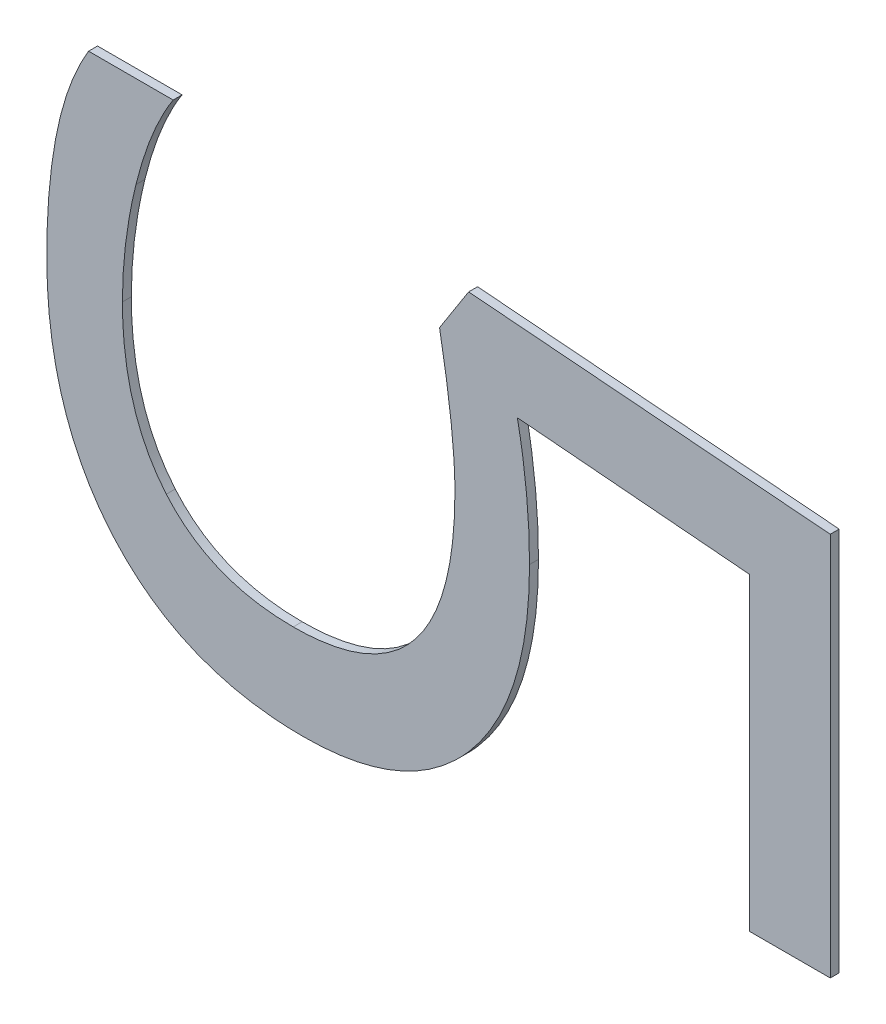
ISO-10303-21;
HEADER;
FILE_DESCRIPTION(('STEP AP214'),'2;1');
FILE_NAME('part.step','',(''),(''),'','','');
FILE_SCHEMA(('AUTOMOTIVE_DESIGN { 1 0 10303 214 1 1 1 1 }'));
ENDSEC;
DATA;
#1=APPLICATION_CONTEXT('core data for automotive mechanical design processes');
#2=APPLICATION_PROTOCOL_DEFINITION('international standard','automotive_design',2000,#1);
#3=PRODUCT_CONTEXT('',#1,'mechanical');
#4=PRODUCT('Part','Part','',(#3));
#5=PRODUCT_RELATED_PRODUCT_CATEGORY('part','',(#4));
#6=PRODUCT_DEFINITION_FORMATION('','',#4);
#7=PRODUCT_DEFINITION_CONTEXT('part definition',#1,'design');
#8=PRODUCT_DEFINITION('design','',#6,#7);
#9=PRODUCT_DEFINITION_SHAPE('','',#8);
#10=(LENGTH_UNIT() NAMED_UNIT(*) SI_UNIT(.MILLI.,.METRE.));
#11=(NAMED_UNIT(*) PLANE_ANGLE_UNIT() SI_UNIT($,.RADIAN.));
#12=(NAMED_UNIT(*) SI_UNIT($,.STERADIAN.) SOLID_ANGLE_UNIT());
#13=UNCERTAINTY_MEASURE_WITH_UNIT(LENGTH_MEASURE(1.E-05),#10,'distance_accuracy_value','');
#14=(GEOMETRIC_REPRESENTATION_CONTEXT(3) GLOBAL_UNCERTAINTY_ASSIGNED_CONTEXT((#13)) GLOBAL_UNIT_ASSIGNED_CONTEXT((#10,
#11,#12)) REPRESENTATION_CONTEXT('',''));
#15=CARTESIAN_POINT('',(0.,0.,0.));
#16=DIRECTION('',(0.,0.,1.));
#17=DIRECTION('',(1.,0.,0.));
#18=AXIS2_PLACEMENT_3D('',#15,#16,#17);
#19=CARTESIAN_POINT('',(32.574920494297,13.734089114766,2.65));
#20=DIRECTION('',(0.,0.,1.));
#21=DIRECTION('',(1.,0.,0.));
#22=AXIS2_PLACEMENT_3D('',#19,#20,#21);
#23=PLANE('',#22);
#24=CARTESIAN_POINT('',(33.67297280187,12.572173262937,2.65));
#25=CARTESIAN_POINT('',(33.749309011932,12.486756165432,2.65));
#26=CARTESIAN_POINT('',(33.883441286861,12.486756165432,2.65));
#27=B_SPLINE_CURVE_WITH_KNOTS('',2,(#24,#25,#26),.UNSPECIFIED.,.F.,.F.,(3,3),(0.,1.),.UNSPECIFIED.);
#28=CARTESIAN_POINT('',(33.67297280187,12.572173262937,2.65));
#29=VERTEX_POINT('',#28);
#30=CARTESIAN_POINT('',(33.883441286861,12.486756165432,2.65));
#31=VERTEX_POINT('',#30);
#32=EDGE_CURVE('E231',#29,#31,#27,.T.);
#33=ORIENTED_EDGE('',*,*,#32,.T.);
#34=CARTESIAN_POINT('',(33.883441286861,12.486756165432,2.65));
#35=CARTESIAN_POINT('',(34.001114453301,12.486756165432,2.65));
#36=CARTESIAN_POINT('',(34.068842738808,12.565078819622,2.65));
#37=B_SPLINE_CURVE_WITH_KNOTS('',2,(#34,#35,#36),.UNSPECIFIED.,.F.,.F.,(3,3),(0.,1.),.UNSPECIFIED.);
#38=CARTESIAN_POINT('',(34.068842738808,12.565078819622,2.65));
#39=VERTEX_POINT('',#38);
#40=EDGE_CURVE('E136',#31,#39,#37,.T.);
#41=ORIENTED_EDGE('',*,*,#40,.T.);
#42=CARTESIAN_POINT('',(34.068842738808,12.565078819622,2.65));
#43=CARTESIAN_POINT('',(34.136571024315,12.643401473812,2.65));
#44=CARTESIAN_POINT('',(34.136571024315,12.779993155757,2.65));
#45=B_SPLINE_CURVE_WITH_KNOTS('',2,(#42,#43,#44),.UNSPECIFIED.,.F.,.F.,(3,3),(0.,1.),.UNSPECIFIED.);
#46=CARTESIAN_POINT('',(34.136571024315,12.779993155757,2.65));
#47=VERTEX_POINT('',#46);
#48=EDGE_CURVE('E135',#39,#47,#45,.T.);
#49=ORIENTED_EDGE('',*,*,#48,.T.);
#50=CARTESIAN_POINT('',(34.136571024315,12.779993155757,2.65));
#51=CARTESIAN_POINT('',(34.136571024315,12.847532256109,2.65));
#52=CARTESIAN_POINT('',(34.122949693152,12.915449726771,2.65));
#53=B_SPLINE_CURVE_WITH_KNOTS('',2,(#50,#51,#52),.UNSPECIFIED.,.F.,.F.,(3,3),(0.,1.),.UNSPECIFIED.);
#54=CARTESIAN_POINT('',(34.122949693152,12.9154497267709,2.65));
#55=VERTEX_POINT('',#54);
#56=EDGE_CURVE('E123',#47,#55,#53,.T.);
#57=ORIENTED_EDGE('',*,*,#56,.T.);
#58=DIRECTION('',(-0.996444857796494,0.0842475244201518,0.));
#59=VECTOR('',#58,1.);
#60=CARTESIAN_POINT('',(34.252730709515,12.904476987778,2.65));
#61=LINE('',#60,#59);
#62=CARTESIAN_POINT('',(34.382511725878,12.8935042487851,2.65));
#63=VERTEX_POINT('',#62);
#64=EDGE_CURVE('E282',#55,#63,#61,.F.);
#65=ORIENTED_EDGE('',*,*,#64,.T.);
#66=DIRECTION('',(0.,1.,0.));
#67=VECTOR('',#66,1.);
#68=CARTESIAN_POINT('',(34.382511725878,12.720589017072,2.65));
#69=LINE('',#68,#67);
#70=CARTESIAN_POINT('',(34.382511725878,12.547673785358,2.65));
#71=VERTEX_POINT('',#70);
#72=EDGE_CURVE('E277',#63,#71,#69,.F.);
#73=ORIENTED_EDGE('',*,*,#72,.T.);
#74=DIRECTION('',(1.,0.,0.));
#75=VECTOR('',#74,1.);
#76=CARTESIAN_POINT('',(34.427726977934,12.547673785358,2.65));
#77=LINE('',#76,#75);
#78=CARTESIAN_POINT('',(34.47294222999,12.547673785358,2.65));
#79=VERTEX_POINT('',#78);
#80=EDGE_CURVE('E271',#71,#79,#77,.T.);
#81=ORIENTED_EDGE('',*,*,#80,.T.);
#82=DIRECTION('',(0.,1.,0.));
#83=VECTOR('',#82,1.);
#84=CARTESIAN_POINT('',(34.47294222999,12.762588121492,2.65));
#85=LINE('',#84,#83);
#86=CARTESIAN_POINT('',(34.47294222999,12.9775024576269,2.65));
#87=VERTEX_POINT('',#86);
#88=EDGE_CURVE('E265',#79,#87,#85,.T.);
#89=ORIENTED_EDGE('',*,*,#88,.T.);
#90=DIRECTION('',(0.996779601288661,-0.0801899398604227,0.));
#91=VECTOR('',#90,1.);
#92=CARTESIAN_POINT('',(34.270703299244,12.993772380961,2.65));
#93=LINE('',#92,#91);
#94=CARTESIAN_POINT('',(34.0684643684981,13.010042304295,2.65));
#95=VERTEX_POINT('',#94);
#96=EDGE_CURVE('E259',#87,#95,#93,.F.);
#97=ORIENTED_EDGE('',*,*,#96,.T.);
#98=DIRECTION('',(0.538698147162689,0.842498846434514,0.));
#99=VECTOR('',#98,1.);
#100=CARTESIAN_POINT('',(34.052194445164,12.984596900941,2.65));
#101=LINE('',#100,#99);
#102=CARTESIAN_POINT('',(34.0359245218299,12.959151497587,2.65));
#103=VERTEX_POINT('',#102);
#104=EDGE_CURVE('E254',#95,#103,#101,.F.);
#105=ORIENTED_EDGE('',*,*,#104,.T.);
#106=CARTESIAN_POINT('',(34.03592452183,12.959151497587,2.65));
#107=CARTESIAN_POINT('',(34.053140370939,12.865126475528,2.65));
#108=CARTESIAN_POINT('',(34.053140370939,12.808938484479,2.65));
#109=B_SPLINE_CURVE_WITH_KNOTS('',2,(#106,#107,#108),.UNSPECIFIED.,.F.,.F.,(3,3),(0.,1.),.UNSPECIFIED.);
#110=CARTESIAN_POINT('',(34.053140370939,12.808938484479,2.65));
#111=VERTEX_POINT('',#110);
#112=EDGE_CURVE('E157',#103,#111,#109,.T.);
#113=ORIENTED_EDGE('',*,*,#112,.T.);
#114=CARTESIAN_POINT('',(34.053140370939,12.808938484479,2.65));
#115=CARTESIAN_POINT('',(34.053140370939,12.587402667918,2.65));
#116=CARTESIAN_POINT('',(33.872279362713,12.587402667918,2.65));
#117=B_SPLINE_CURVE_WITH_KNOTS('',2,(#114,#115,#116),.UNSPECIFIED.,.F.,.F.,(3,3),(0.,1.),.UNSPECIFIED.);
#118=CARTESIAN_POINT('',(33.872279362713,12.587402667918,2.65));
#119=VERTEX_POINT('',#118);
#120=EDGE_CURVE('E167',#111,#119,#117,.T.);
#121=ORIENTED_EDGE('',*,*,#120,.T.);
#122=CARTESIAN_POINT('',(33.872279362713,12.587402667918,2.65));
#123=CARTESIAN_POINT('',(33.779389451585,12.587402667918,2.65));
#124=CARTESIAN_POINT('',(33.73029590385,12.64500954763,2.65));
#125=B_SPLINE_CURVE_WITH_KNOTS('',2,(#122,#123,#124),.UNSPECIFIED.,.F.,.F.,(3,3),(0.,1.),.UNSPECIFIED.);
#126=CARTESIAN_POINT('',(33.73029590385,12.64500954763,2.65));
#127=VERTEX_POINT('',#126);
#128=EDGE_CURVE('E176',#119,#127,#125,.T.);
#129=ORIENTED_EDGE('',*,*,#128,.T.);
#130=CARTESIAN_POINT('',(33.73029590385,12.64500954763,2.65));
#131=CARTESIAN_POINT('',(33.681202356115,12.702616427342,2.65));
#132=CARTESIAN_POINT('',(33.681202356115,12.806668262618,2.65));
#133=B_SPLINE_CURVE_WITH_KNOTS('',2,(#130,#131,#132),.UNSPECIFIED.,.F.,.F.,(3,3),(0.,1.),.UNSPECIFIED.);
#134=CARTESIAN_POINT('',(33.681202356115,12.806668262618,2.65));
#135=VERTEX_POINT('',#134);
#136=EDGE_CURVE('E185',#127,#135,#133,.T.);
#137=ORIENTED_EDGE('',*,*,#136,.T.);
#138=CARTESIAN_POINT('',(33.681202356115,12.806668262618,2.65));
#139=CARTESIAN_POINT('',(33.681202356115,12.866450771614,2.65));
#140=CARTESIAN_POINT('',(33.696337168519,12.927935947004,2.65));
#141=B_SPLINE_CURVE_WITH_KNOTS('',2,(#138,#139,#140),.UNSPECIFIED.,.F.,.F.,(3,3),(0.,1.),.UNSPECIFIED.);
#142=CARTESIAN_POINT('',(33.696337168519,12.927935947004,2.65));
#143=VERTEX_POINT('',#142);
#144=EDGE_CURVE('E194',#135,#143,#141,.T.);
#145=ORIENTED_EDGE('',*,*,#144,.T.);
#146=CARTESIAN_POINT('',(33.696337168519,12.927935947004,2.65));
#147=CARTESIAN_POINT('',(33.711471980923,12.989421122395,2.65));
#148=CARTESIAN_POINT('',(33.737957902629,13.030663486195,2.65));
#149=B_SPLINE_CURVE_WITH_KNOTS('',2,(#146,#147,#148),.UNSPECIFIED.,.F.,.F.,(3,3),(0.,1.),.UNSPECIFIED.);
#150=CARTESIAN_POINT('',(33.737957902629,13.030663486195,2.65));
#151=VERTEX_POINT('',#150);
#152=EDGE_CURVE('E203',#143,#151,#149,.T.);
#153=ORIENTED_EDGE('',*,*,#152,.T.);
#154=DIRECTION('',(1.,0.,0.));
#155=VECTOR('',#154,1.);
#156=CARTESIAN_POINT('',(33.690661613867,13.030663486195,2.65));
#157=LINE('',#156,#155);
#158=CARTESIAN_POINT('',(33.643365325105,13.030663486195,2.65));
#159=VERTEX_POINT('',#158);
#160=EDGE_CURVE('E247',#151,#159,#157,.F.);
#161=ORIENTED_EDGE('',*,*,#160,.T.);
#162=CARTESIAN_POINT('',(33.643365325105,13.030663486195,2.65));
#163=CARTESIAN_POINT('',(33.596636591809,12.953854313246,2.65));
#164=CARTESIAN_POINT('',(33.596636591809,12.807803373549,2.65));
#165=B_SPLINE_CURVE_WITH_KNOTS('',2,(#162,#163,#164),.UNSPECIFIED.,.F.,.F.,(3,3),(0.,1.),.UNSPECIFIED.);
#166=CARTESIAN_POINT('',(33.596636591809,12.807803373549,2.65));
#167=VERTEX_POINT('',#166);
#168=EDGE_CURVE('E212',#159,#167,#165,.T.);
#169=ORIENTED_EDGE('',*,*,#168,.T.);
#170=CARTESIAN_POINT('',(33.596636591809,12.807803373549,2.65));
#171=CARTESIAN_POINT('',(33.596636591809,12.657590360441,2.65));
#172=CARTESIAN_POINT('',(33.67297280187,12.572173262937,2.65));
#173=B_SPLINE_CURVE_WITH_KNOTS('',2,(#170,#171,#172),.UNSPECIFIED.,.F.,.F.,(3,3),(0.,1.),.UNSPECIFIED.);
#174=EDGE_CURVE('E222',#167,#29,#173,.T.);
#175=ORIENTED_EDGE('',*,*,#174,.T.);
#176=EDGE_LOOP('',(#33,#41,#49,#57,#65,#73,#81,#89,#97,#105,#113,#121,#129,#137,#145,#153,#161,
#169,#175));
#177=FACE_BOUND('',#176,.T.);
#178=ADVANCED_FACE('F17',(#177),#23,.T.);
#179=CARTESIAN_POINT('',(34.122949693152,12.915449726771,2.64));
#180=CARTESIAN_POINT('',(34.136571024315,12.847532256109,2.64));
#181=CARTESIAN_POINT('',(34.136571024315,12.779993155757,2.64));
#182=(BOUNDED_CURVE() B_SPLINE_CURVE(2,(#179,#180,#181),.UNSPECIFIED.,.F.,
.F.) B_SPLINE_CURVE_WITH_KNOTS((3,3),(0.,1.),
.UNSPECIFIED.) CURVE() GEOMETRIC_REPRESENTATION_ITEM() RATIONAL_B_SPLINE_CURVE((1.,1.,1.)) REPRESENTATION_ITEM(''));
#183=DIRECTION('',(0.,0.,1.));
#184=VECTOR('',#183,1.);
#185=SURFACE_OF_LINEAR_EXTRUSION('',#182,#184);
#186=DIRECTION('',(0.,0.,1.));
#187=VECTOR('',#186,1.);
#188=CARTESIAN_POINT('',(34.136571024315,12.779993155757,2.64));
#189=LINE('',#188,#187);
#190=CARTESIAN_POINT('',(34.136571024315,12.779993155757,2.64));
#191=VERTEX_POINT('',#190);
#192=EDGE_CURVE('E127',#47,#191,#189,.F.);
#193=ORIENTED_EDGE('',*,*,#192,.T.);
#194=CARTESIAN_POINT('',(34.136571024315,12.779993155757,2.64));
#195=CARTESIAN_POINT('',(34.136571024315,12.847532256109,2.64));
#196=CARTESIAN_POINT('',(34.122949693152,12.915449726771,2.64));
#197=B_SPLINE_CURVE_WITH_KNOTS('',2,(#194,#195,#196),.UNSPECIFIED.,.F.,.F.,(3,3),(0.,1.),.UNSPECIFIED.);
#198=CARTESIAN_POINT('',(34.122949693152,12.9154497267709,2.64));
#199=VERTEX_POINT('',#198);
#200=EDGE_CURVE('E139',#191,#199,#197,.T.);
#201=ORIENTED_EDGE('',*,*,#200,.T.);
#202=DIRECTION('',(0.,0.,1.));
#203=VECTOR('',#202,1.);
#204=CARTESIAN_POINT('',(34.122949693152,12.9154497267708,2.64));
#205=LINE('',#204,#203);
#206=EDGE_CURVE('E128',#199,#55,#205,.T.);
#207=ORIENTED_EDGE('',*,*,#206,.T.);
#208=ORIENTED_EDGE('',*,*,#56,.F.);
#209=EDGE_LOOP('',(#193,#201,#207,#208));
#210=FACE_BOUND('',#209,.T.);
#211=ADVANCED_FACE('F125',(#210),#185,.F.);
#212=CARTESIAN_POINT('',(34.252730709515,12.904476987778,2.64));
#213=DIRECTION('',(0.0842475244201518,0.996444857796494,0.));
#214=DIRECTION('',(-0.996444857796494,0.0842475244201518,0.));
#215=AXIS2_PLACEMENT_3D('',#212,#213,#214);
#216=PLANE('',#215);
#217=ORIENTED_EDGE('',*,*,#206,.F.);
#218=DIRECTION('',(0.996444857796362,-0.0842475244217159,0.));
#219=VECTOR('',#218,1.);
#220=CARTESIAN_POINT('',(34.122949693152,12.915449726771,2.64));
#221=LINE('',#220,#219);
#222=CARTESIAN_POINT('',(34.382511725878,12.893504248785,2.64));
#223=VERTEX_POINT('',#222);
#224=EDGE_CURVE('E141',#199,#223,#221,.T.);
#225=ORIENTED_EDGE('',*,*,#224,.T.);
#226=DIRECTION('',(0.,0.,-1.));
#227=VECTOR('',#226,1.);
#228=CARTESIAN_POINT('',(34.382511725878,12.893504248785,2.64));
#229=LINE('',#228,#227);
#230=EDGE_CURVE('E280',#223,#63,#229,.F.);
#231=ORIENTED_EDGE('',*,*,#230,.T.);
#232=ORIENTED_EDGE('',*,*,#64,.F.);
#233=EDGE_LOOP('',(#217,#225,#231,#232));
#234=FACE_BOUND('',#233,.T.);
#235=ADVANCED_FACE('F363',(#234),#216,.F.);
#236=CARTESIAN_POINT('',(34.382511725878,12.720589017072,2.64));
#237=DIRECTION('',(1.,0.,0.));
#238=DIRECTION('',(0.,0.,-1.));
#239=AXIS2_PLACEMENT_3D('',#236,#237,#238);
#240=PLANE('',#239);
#241=ORIENTED_EDGE('',*,*,#230,.F.);
#242=DIRECTION('',(0.,1.,0.));
#243=VECTOR('',#242,1.);
#244=CARTESIAN_POINT('',(34.382511725878,13.734089114766,2.64));
#245=LINE('',#244,#243);
#246=CARTESIAN_POINT('',(34.382511725878,12.547673785358,2.64));
#247=VERTEX_POINT('',#246);
#248=EDGE_CURVE('E291',#223,#247,#245,.F.);
#249=ORIENTED_EDGE('',*,*,#248,.T.);
#250=DIRECTION('',(0.,0.,1.));
#251=VECTOR('',#250,1.);
#252=CARTESIAN_POINT('',(34.382511725878,12.547673785358,2.64));
#253=LINE('',#252,#251);
#254=EDGE_CURVE('E274',#247,#71,#253,.T.);
#255=ORIENTED_EDGE('',*,*,#254,.T.);
#256=ORIENTED_EDGE('',*,*,#72,.F.);
#257=EDGE_LOOP('',(#241,#249,#255,#256));
#258=FACE_BOUND('',#257,.T.);
#259=ADVANCED_FACE('F359',(#258),#240,.F.);
#260=CARTESIAN_POINT('',(34.427726977934,12.547673785358,2.64));
#261=DIRECTION('',(0.,1.,0.));
#262=DIRECTION('',(0.,0.,1.));
#263=AXIS2_PLACEMENT_3D('',#260,#261,#262);
#264=PLANE('',#263);
#265=ORIENTED_EDGE('',*,*,#254,.F.);
#266=DIRECTION('',(1.,0.,0.));
#267=VECTOR('',#266,1.);
#268=CARTESIAN_POINT('',(32.574920494297,12.547673785358,2.64));
#269=LINE('',#268,#267);
#270=CARTESIAN_POINT('',(34.47294222999,12.547673785358,2.64));
#271=VERTEX_POINT('',#270);
#272=EDGE_CURVE('E294',#247,#271,#269,.T.);
#273=ORIENTED_EDGE('',*,*,#272,.T.);
#274=DIRECTION('',(0.,0.,1.));
#275=VECTOR('',#274,1.);
#276=CARTESIAN_POINT('',(34.47294222999,12.547673785358,2.64));
#277=LINE('',#276,#275);
#278=EDGE_CURVE('E268',#271,#79,#277,.T.);
#279=ORIENTED_EDGE('',*,*,#278,.T.);
#280=ORIENTED_EDGE('',*,*,#80,.F.);
#281=EDGE_LOOP('',(#265,#273,#279,#280));
#282=FACE_BOUND('',#281,.T.);
#283=ADVANCED_FACE('F355',(#282),#264,.F.);
#284=CARTESIAN_POINT('',(34.47294222999,12.762588121492,2.64));
#285=DIRECTION('',(-1.,0.,0.));
#286=DIRECTION('',(0.,0.,1.));
#287=AXIS2_PLACEMENT_3D('',#284,#285,#286);
#288=PLANE('',#287);
#289=ORIENTED_EDGE('',*,*,#278,.F.);
#290=DIRECTION('',(0.,1.,0.));
#291=VECTOR('',#290,1.);
#292=CARTESIAN_POINT('',(34.47294222999,13.734089114766,2.64));
#293=LINE('',#292,#291);
#294=CARTESIAN_POINT('',(34.47294222999,12.977502457627,2.64));
#295=VERTEX_POINT('',#294);
#296=EDGE_CURVE('E303',#271,#295,#293,.T.);
#297=ORIENTED_EDGE('',*,*,#296,.T.);
#298=DIRECTION('',(0.,0.,1.));
#299=VECTOR('',#298,1.);
#300=CARTESIAN_POINT('',(34.47294222999,12.9775024576269,2.64));
#301=LINE('',#300,#299);
#302=EDGE_CURVE('E262',#295,#87,#301,.T.);
#303=ORIENTED_EDGE('',*,*,#302,.T.);
#304=ORIENTED_EDGE('',*,*,#88,.F.);
#305=EDGE_LOOP('',(#289,#297,#303,#304));
#306=FACE_BOUND('',#305,.T.);
#307=ADVANCED_FACE('F351',(#306),#288,.F.);
#308=CARTESIAN_POINT('',(34.270703299244,12.993772380961,2.64));
#309=DIRECTION('',(-0.0801899398604227,-0.996779601288661,0.));
#310=DIRECTION('',(0.996779601288661,-0.0801899398604227,0.));
#311=AXIS2_PLACEMENT_3D('',#308,#309,#310);
#312=PLANE('',#311);
#313=ORIENTED_EDGE('',*,*,#302,.F.);
#314=DIRECTION('',(-0.996779601288699,0.0801899398599488,0.));
#315=VECTOR('',#314,1.);
#316=CARTESIAN_POINT('',(34.47294222999,12.977502457627,2.64));
#317=LINE('',#316,#315);
#318=CARTESIAN_POINT('',(34.068464368498,13.010042304295,2.64));
#319=VERTEX_POINT('',#318);
#320=EDGE_CURVE('E312',#295,#319,#317,.T.);
#321=ORIENTED_EDGE('',*,*,#320,.T.);
#322=DIRECTION('',(0.,0.,1.));
#323=VECTOR('',#322,1.);
#324=CARTESIAN_POINT('',(34.0684643684981,13.0100423042949,2.64));
#325=LINE('',#324,#323);
#326=EDGE_CURVE('E256',#319,#95,#325,.T.);
#327=ORIENTED_EDGE('',*,*,#326,.T.);
#328=ORIENTED_EDGE('',*,*,#96,.F.);
#329=EDGE_LOOP('',(#313,#321,#327,#328));
#330=FACE_BOUND('',#329,.T.);
#331=ADVANCED_FACE('F347',(#330),#312,.F.);
#332=CARTESIAN_POINT('',(34.052194445164,12.984596900941,2.64));
#333=DIRECTION('',(0.842498846434514,-0.538698147162689,0.));
#334=DIRECTION('',(0.538698147162689,0.842498846434514,0.));
#335=AXIS2_PLACEMENT_3D('',#332,#333,#334);
#336=PLANE('',#335);
#337=ORIENTED_EDGE('',*,*,#326,.F.);
#338=DIRECTION('',(-0.538698147159,-0.842498846436872,0.));
#339=VECTOR('',#338,1.);
#340=CARTESIAN_POINT('',(34.068464368498,13.010042304295,2.64));
#341=LINE('',#340,#339);
#342=CARTESIAN_POINT('',(34.03592452183,12.959151497587,2.64));
#343=VERTEX_POINT('',#342);
#344=EDGE_CURVE('E321',#319,#343,#341,.T.);
#345=ORIENTED_EDGE('',*,*,#344,.T.);
#346=DIRECTION('',(0.,0.,1.));
#347=VECTOR('',#346,1.);
#348=CARTESIAN_POINT('',(34.03592452183,12.959151497587,2.64));
#349=LINE('',#348,#347);
#350=EDGE_CURVE('E166',#343,#103,#349,.T.);
#351=ORIENTED_EDGE('',*,*,#350,.T.);
#352=ORIENTED_EDGE('',*,*,#104,.F.);
#353=EDGE_LOOP('',(#337,#345,#351,#352));
#354=FACE_BOUND('',#353,.T.);
#355=ADVANCED_FACE('F342',(#354),#336,.F.);
#356=CARTESIAN_POINT('',(34.053140370939,12.808938484479,2.64));
#357=CARTESIAN_POINT('',(34.053140370939,12.865126475528,2.64));
#358=CARTESIAN_POINT('',(34.03592452183,12.959151497587,2.64));
#359=(BOUNDED_CURVE() B_SPLINE_CURVE(2,(#356,#357,#358),.UNSPECIFIED.,.F.,
.F.) B_SPLINE_CURVE_WITH_KNOTS((3,3),(0.,1.),
.UNSPECIFIED.) CURVE() GEOMETRIC_REPRESENTATION_ITEM() RATIONAL_B_SPLINE_CURVE((1.,1.,1.)) REPRESENTATION_ITEM(''));
#360=DIRECTION('',(0.,0.,1.));
#361=VECTOR('',#360,1.);
#362=SURFACE_OF_LINEAR_EXTRUSION('',#359,#361);
#363=ORIENTED_EDGE('',*,*,#350,.F.);
#364=CARTESIAN_POINT('',(34.03592452183,12.959151497587,2.64));
#365=CARTESIAN_POINT('',(34.053140370939,12.865126475528,2.64));
#366=CARTESIAN_POINT('',(34.053140370939,12.808938484479,2.64));
#367=B_SPLINE_CURVE_WITH_KNOTS('',2,(#364,#365,#366),.UNSPECIFIED.,.F.,.F.,(3,3),(0.,1.),.UNSPECIFIED.);
#368=CARTESIAN_POINT('',(34.053140370939,12.808938484479,2.64));
#369=VERTEX_POINT('',#368);
#370=EDGE_CURVE('E391',#343,#369,#367,.T.);
#371=ORIENTED_EDGE('',*,*,#370,.T.);
#372=DIRECTION('',(0.,0.,1.));
#373=VECTOR('',#372,1.);
#374=CARTESIAN_POINT('',(34.053140370939,12.808938484479,2.64));
#375=LINE('',#374,#373);
#376=EDGE_CURVE('E165',#369,#111,#375,.T.);
#377=ORIENTED_EDGE('',*,*,#376,.T.);
#378=ORIENTED_EDGE('',*,*,#112,.F.);
#379=EDGE_LOOP('',(#363,#371,#377,#378));
#380=FACE_BOUND('',#379,.T.);
#381=ADVANCED_FACE('F337',(#380),#362,.F.);
#382=CARTESIAN_POINT('',(33.872279362713,12.587402667918,2.64));
#383=CARTESIAN_POINT('',(34.053140370939,12.587402667918,2.64));
#384=CARTESIAN_POINT('',(34.053140370939,12.808938484479,2.64));
#385=(BOUNDED_CURVE() B_SPLINE_CURVE(2,(#382,#383,#384),.UNSPECIFIED.,.F.,
.F.) B_SPLINE_CURVE_WITH_KNOTS((3,3),(0.,1.),
.UNSPECIFIED.) CURVE() GEOMETRIC_REPRESENTATION_ITEM() RATIONAL_B_SPLINE_CURVE((1.,1.,1.)) REPRESENTATION_ITEM(''));
#386=DIRECTION('',(0.,0.,1.));
#387=VECTOR('',#386,1.);
#388=SURFACE_OF_LINEAR_EXTRUSION('',#385,#387);
#389=ORIENTED_EDGE('',*,*,#376,.F.);
#390=CARTESIAN_POINT('',(34.053140370939,12.808938484479,2.64));
#391=CARTESIAN_POINT('',(34.053140370939,12.587402667918,2.64));
#392=CARTESIAN_POINT('',(33.872279362713,12.587402667918,2.64));
#393=B_SPLINE_CURVE_WITH_KNOTS('',2,(#390,#391,#392),.UNSPECIFIED.,.F.,.F.,(3,3),(0.,1.),.UNSPECIFIED.);
#394=CARTESIAN_POINT('',(33.872279362713,12.587402667918,2.64));
#395=VERTEX_POINT('',#394);
#396=EDGE_CURVE('E395',#369,#395,#393,.T.);
#397=ORIENTED_EDGE('',*,*,#396,.T.);
#398=DIRECTION('',(0.,0.,1.));
#399=VECTOR('',#398,1.);
#400=CARTESIAN_POINT('',(33.872279362713,12.587402667918,2.64));
#401=LINE('',#400,#399);
#402=EDGE_CURVE('E175',#395,#119,#401,.T.);
#403=ORIENTED_EDGE('',*,*,#402,.T.);
#404=ORIENTED_EDGE('',*,*,#120,.F.);
#405=EDGE_LOOP('',(#389,#397,#403,#404));
#406=FACE_BOUND('',#405,.T.);
#407=ADVANCED_FACE('F341',(#406),#388,.F.);
#408=CARTESIAN_POINT('',(33.73029590385,12.64500954763,2.64));
#409=CARTESIAN_POINT('',(33.779389451585,12.587402667918,2.64));
#410=CARTESIAN_POINT('',(33.872279362713,12.587402667918,2.64));
#411=(BOUNDED_CURVE() B_SPLINE_CURVE(2,(#408,#409,#410),.UNSPECIFIED.,.F.,
.F.) B_SPLINE_CURVE_WITH_KNOTS((3,3),(0.,1.),
.UNSPECIFIED.) CURVE() GEOMETRIC_REPRESENTATION_ITEM() RATIONAL_B_SPLINE_CURVE((1.,1.,1.)) REPRESENTATION_ITEM(''));
#412=DIRECTION('',(0.,0.,1.));
#413=VECTOR('',#412,1.);
#414=SURFACE_OF_LINEAR_EXTRUSION('',#411,#413);
#415=ORIENTED_EDGE('',*,*,#402,.F.);
#416=CARTESIAN_POINT('',(33.872279362713,12.587402667918,2.64));
#417=CARTESIAN_POINT('',(33.779389451585,12.587402667918,2.64));
#418=CARTESIAN_POINT('',(33.73029590385,12.64500954763,2.64));
#419=B_SPLINE_CURVE_WITH_KNOTS('',2,(#416,#417,#418),.UNSPECIFIED.,.F.,.F.,(3,3),(0.,1.),.UNSPECIFIED.);
#420=CARTESIAN_POINT('',(33.73029590385,12.64500954763,2.64));
#421=VERTEX_POINT('',#420);
#422=EDGE_CURVE('E399',#395,#421,#419,.T.);
#423=ORIENTED_EDGE('',*,*,#422,.T.);
#424=DIRECTION('',(0.,0.,1.));
#425=VECTOR('',#424,1.);
#426=CARTESIAN_POINT('',(33.73029590385,12.64500954763,2.64));
#427=LINE('',#426,#425);
#428=EDGE_CURVE('E184',#421,#127,#427,.T.);
#429=ORIENTED_EDGE('',*,*,#428,.T.);
#430=ORIENTED_EDGE('',*,*,#128,.F.);
#431=EDGE_LOOP('',(#415,#423,#429,#430));
#432=FACE_BOUND('',#431,.T.);
#433=ADVANCED_FACE('F542',(#432),#414,.F.);
#434=CARTESIAN_POINT('',(33.681202356115,12.806668262618,2.64));
#435=CARTESIAN_POINT('',(33.681202356115,12.702616427342,2.64));
#436=CARTESIAN_POINT('',(33.73029590385,12.64500954763,2.64));
#437=(BOUNDED_CURVE() B_SPLINE_CURVE(2,(#434,#435,#436),.UNSPECIFIED.,.F.,
.F.) B_SPLINE_CURVE_WITH_KNOTS((3,3),(0.,1.),
.UNSPECIFIED.) CURVE() GEOMETRIC_REPRESENTATION_ITEM() RATIONAL_B_SPLINE_CURVE((1.,1.,1.)) REPRESENTATION_ITEM(''));
#438=DIRECTION('',(0.,0.,1.));
#439=VECTOR('',#438,1.);
#440=SURFACE_OF_LINEAR_EXTRUSION('',#437,#439);
#441=ORIENTED_EDGE('',*,*,#428,.F.);
#442=CARTESIAN_POINT('',(33.73029590385,12.64500954763,2.64));
#443=CARTESIAN_POINT('',(33.681202356115,12.702616427342,2.64));
#444=CARTESIAN_POINT('',(33.681202356115,12.806668262618,2.64));
#445=B_SPLINE_CURVE_WITH_KNOTS('',2,(#442,#443,#444),.UNSPECIFIED.,.F.,.F.,(3,3),(0.,1.),.UNSPECIFIED.);
#446=CARTESIAN_POINT('',(33.681202356115,12.806668262618,2.64));
#447=VERTEX_POINT('',#446);
#448=EDGE_CURVE('E403',#421,#447,#445,.T.);
#449=ORIENTED_EDGE('',*,*,#448,.T.);
#450=DIRECTION('',(0.,0.,1.));
#451=VECTOR('',#450,1.);
#452=CARTESIAN_POINT('',(33.681202356115,12.806668262618,2.64));
#453=LINE('',#452,#451);
#454=EDGE_CURVE('E193',#447,#135,#453,.T.);
#455=ORIENTED_EDGE('',*,*,#454,.T.);
#456=ORIENTED_EDGE('',*,*,#136,.F.);
#457=EDGE_LOOP('',(#441,#449,#455,#456));
#458=FACE_BOUND('',#457,.T.);
#459=ADVANCED_FACE('F540',(#458),#440,.F.);
#460=CARTESIAN_POINT('',(33.696337168519,12.927935947004,2.64));
#461=CARTESIAN_POINT('',(33.681202356115,12.866450771614,2.64));
#462=CARTESIAN_POINT('',(33.681202356115,12.806668262618,2.64));
#463=(BOUNDED_CURVE() B_SPLINE_CURVE(2,(#460,#461,#462),.UNSPECIFIED.,.F.,
.F.) B_SPLINE_CURVE_WITH_KNOTS((3,3),(0.,1.),
.UNSPECIFIED.) CURVE() GEOMETRIC_REPRESENTATION_ITEM() RATIONAL_B_SPLINE_CURVE((1.,1.,1.)) REPRESENTATION_ITEM(''));
#464=DIRECTION('',(0.,0.,1.));
#465=VECTOR('',#464,1.);
#466=SURFACE_OF_LINEAR_EXTRUSION('',#463,#465);
#467=ORIENTED_EDGE('',*,*,#454,.F.);
#468=CARTESIAN_POINT('',(33.681202356115,12.806668262618,2.64));
#469=CARTESIAN_POINT('',(33.681202356115,12.866450771614,2.64));
#470=CARTESIAN_POINT('',(33.696337168519,12.927935947004,2.64));
#471=B_SPLINE_CURVE_WITH_KNOTS('',2,(#468,#469,#470),.UNSPECIFIED.,.F.,.F.,(3,3),(0.,1.),.UNSPECIFIED.);
#472=CARTESIAN_POINT('',(33.696337168519,12.927935947004,2.64));
#473=VERTEX_POINT('',#472);
#474=EDGE_CURVE('E407',#447,#473,#471,.T.);
#475=ORIENTED_EDGE('',*,*,#474,.T.);
#476=DIRECTION('',(0.,0.,1.));
#477=VECTOR('',#476,1.);
#478=CARTESIAN_POINT('',(33.696337168519,12.927935947004,2.64));
#479=LINE('',#478,#477);
#480=EDGE_CURVE('E202',#473,#143,#479,.T.);
#481=ORIENTED_EDGE('',*,*,#480,.T.);
#482=ORIENTED_EDGE('',*,*,#144,.F.);
#483=EDGE_LOOP('',(#467,#475,#481,#482));
#484=FACE_BOUND('',#483,.T.);
#485=ADVANCED_FACE('F511',(#484),#466,.F.);
#486=CARTESIAN_POINT('',(33.737957902629,13.030663486195,2.64));
#487=CARTESIAN_POINT('',(33.711471980923,12.989421122395,2.64));
#488=CARTESIAN_POINT('',(33.696337168519,12.927935947004,2.64));
#489=(BOUNDED_CURVE() B_SPLINE_CURVE(2,(#486,#487,#488),.UNSPECIFIED.,.F.,
.F.) B_SPLINE_CURVE_WITH_KNOTS((3,3),(0.,1.),
.UNSPECIFIED.) CURVE() GEOMETRIC_REPRESENTATION_ITEM() RATIONAL_B_SPLINE_CURVE((1.,1.,1.)) REPRESENTATION_ITEM(''));
#490=DIRECTION('',(0.,0.,1.));
#491=VECTOR('',#490,1.);
#492=SURFACE_OF_LINEAR_EXTRUSION('',#489,#491);
#493=ORIENTED_EDGE('',*,*,#480,.F.);
#494=CARTESIAN_POINT('',(33.696337168519,12.927935947004,2.64));
#495=CARTESIAN_POINT('',(33.711471980923,12.989421122395,2.64));
#496=CARTESIAN_POINT('',(33.737957902629,13.030663486195,2.64));
#497=B_SPLINE_CURVE_WITH_KNOTS('',2,(#494,#495,#496),.UNSPECIFIED.,.F.,.F.,(3,3),(0.,1.),.UNSPECIFIED.);
#498=CARTESIAN_POINT('',(33.737957902629,13.030663486195,2.64));
#499=VERTEX_POINT('',#498);
#500=EDGE_CURVE('E411',#473,#499,#497,.T.);
#501=ORIENTED_EDGE('',*,*,#500,.T.);
#502=DIRECTION('',(0.,0.,-1.));
#503=VECTOR('',#502,1.);
#504=CARTESIAN_POINT('',(33.737957902629,13.030663486195,2.64));
#505=LINE('',#504,#503);
#506=EDGE_CURVE('E211',#499,#151,#505,.F.);
#507=ORIENTED_EDGE('',*,*,#506,.T.);
#508=ORIENTED_EDGE('',*,*,#152,.F.);
#509=EDGE_LOOP('',(#493,#501,#507,#508));
#510=FACE_BOUND('',#509,.T.);
#511=ADVANCED_FACE('F506',(#510),#492,.F.);
#512=CARTESIAN_POINT('',(33.690661613867,13.030663486195,2.64));
#513=DIRECTION('',(0.,-1.,0.));
#514=DIRECTION('',(0.,0.,-1.));
#515=AXIS2_PLACEMENT_3D('',#512,#513,#514);
#516=PLANE('',#515);
#517=ORIENTED_EDGE('',*,*,#506,.F.);
#518=DIRECTION('',(1.,0.,0.));
#519=VECTOR('',#518,1.);
#520=CARTESIAN_POINT('',(32.574920494297,13.030663486195,2.64));
#521=LINE('',#520,#519);
#522=CARTESIAN_POINT('',(33.643365325105,13.030663486195,2.64));
#523=VERTEX_POINT('',#522);
#524=EDGE_CURVE('E434',#499,#523,#521,.F.);
#525=ORIENTED_EDGE('',*,*,#524,.T.);
#526=DIRECTION('',(0.,0.,1.));
#527=VECTOR('',#526,1.);
#528=CARTESIAN_POINT('',(33.643365325105,13.030663486195,2.64));
#529=LINE('',#528,#527);
#530=EDGE_CURVE('E221',#523,#159,#529,.T.);
#531=ORIENTED_EDGE('',*,*,#530,.T.);
#532=ORIENTED_EDGE('',*,*,#160,.F.);
#533=EDGE_LOOP('',(#517,#525,#531,#532));
#534=FACE_BOUND('',#533,.T.);
#535=ADVANCED_FACE('F502',(#534),#516,.F.);
#536=CARTESIAN_POINT('',(33.596636591809,12.807803373549,2.64));
#537=CARTESIAN_POINT('',(33.596636591809,12.953854313246,2.64));
#538=CARTESIAN_POINT('',(33.643365325105,13.030663486195,2.64));
#539=(BOUNDED_CURVE() B_SPLINE_CURVE(2,(#536,#537,#538),.UNSPECIFIED.,.F.,
.F.) B_SPLINE_CURVE_WITH_KNOTS((3,3),(0.,1.),
.UNSPECIFIED.) CURVE() GEOMETRIC_REPRESENTATION_ITEM() RATIONAL_B_SPLINE_CURVE((1.,1.,1.)) REPRESENTATION_ITEM(''));
#540=DIRECTION('',(0.,0.,1.));
#541=VECTOR('',#540,1.);
#542=SURFACE_OF_LINEAR_EXTRUSION('',#539,#541);
#543=ORIENTED_EDGE('',*,*,#530,.F.);
#544=CARTESIAN_POINT('',(33.643365325105,13.030663486195,2.64));
#545=CARTESIAN_POINT('',(33.596636591809,12.953854313246,2.64));
#546=CARTESIAN_POINT('',(33.596636591809,12.807803373549,2.64));
#547=B_SPLINE_CURVE_WITH_KNOTS('',2,(#544,#545,#546),.UNSPECIFIED.,.F.,.F.,(3,3),(0.,1.),.UNSPECIFIED.);
#548=CARTESIAN_POINT('',(33.596636591809,12.807803373549,2.64));
#549=VERTEX_POINT('',#548);
#550=EDGE_CURVE('E415',#523,#549,#547,.T.);
#551=ORIENTED_EDGE('',*,*,#550,.T.);
#552=DIRECTION('',(0.,0.,1.));
#553=VECTOR('',#552,1.);
#554=CARTESIAN_POINT('',(33.596636591809,12.807803373549,2.64));
#555=LINE('',#554,#553);
#556=EDGE_CURVE('E220',#549,#167,#555,.T.);
#557=ORIENTED_EDGE('',*,*,#556,.T.);
#558=ORIENTED_EDGE('',*,*,#168,.F.);
#559=EDGE_LOOP('',(#543,#551,#557,#558));
#560=FACE_BOUND('',#559,.T.);
#561=ADVANCED_FACE('F499',(#560),#542,.F.);
#562=CARTESIAN_POINT('',(33.67297280187,12.572173262937,2.64));
#563=CARTESIAN_POINT('',(33.596636591809,12.657590360441,2.64));
#564=CARTESIAN_POINT('',(33.596636591809,12.807803373549,2.64));
#565=(BOUNDED_CURVE() B_SPLINE_CURVE(2,(#562,#563,#564),.UNSPECIFIED.,.F.,
.F.) B_SPLINE_CURVE_WITH_KNOTS((3,3),(0.,1.),
.UNSPECIFIED.) CURVE() GEOMETRIC_REPRESENTATION_ITEM() RATIONAL_B_SPLINE_CURVE((1.,1.,1.)) REPRESENTATION_ITEM(''));
#566=DIRECTION('',(0.,0.,1.));
#567=VECTOR('',#566,1.);
#568=SURFACE_OF_LINEAR_EXTRUSION('',#565,#567);
#569=ORIENTED_EDGE('',*,*,#556,.F.);
#570=CARTESIAN_POINT('',(33.596636591809,12.807803373549,2.64));
#571=CARTESIAN_POINT('',(33.596636591809,12.657590360441,2.64));
#572=CARTESIAN_POINT('',(33.67297280187,12.572173262937,2.64));
#573=B_SPLINE_CURVE_WITH_KNOTS('',2,(#570,#571,#572),.UNSPECIFIED.,.F.,.F.,(3,3),(0.,1.),.UNSPECIFIED.);
#574=CARTESIAN_POINT('',(33.67297280187,12.572173262937,2.64));
#575=VERTEX_POINT('',#574);
#576=EDGE_CURVE('E419',#549,#575,#573,.T.);
#577=ORIENTED_EDGE('',*,*,#576,.T.);
#578=DIRECTION('',(0.,0.,1.));
#579=VECTOR('',#578,1.);
#580=CARTESIAN_POINT('',(33.67297280187,12.572173262937,2.64));
#581=LINE('',#580,#579);
#582=EDGE_CURVE('E230',#575,#29,#581,.T.);
#583=ORIENTED_EDGE('',*,*,#582,.T.);
#584=ORIENTED_EDGE('',*,*,#174,.F.);
#585=EDGE_LOOP('',(#569,#577,#583,#584));
#586=FACE_BOUND('',#585,.T.);
#587=ADVANCED_FACE('F470',(#586),#568,.F.);
#588=CARTESIAN_POINT('',(33.883441286861,12.486756165432,2.64));
#589=CARTESIAN_POINT('',(33.749309011932,12.486756165432,2.64));
#590=CARTESIAN_POINT('',(33.67297280187,12.572173262937,2.64));
#591=(BOUNDED_CURVE() B_SPLINE_CURVE(2,(#588,#589,#590),.UNSPECIFIED.,.F.,
.F.) B_SPLINE_CURVE_WITH_KNOTS((3,3),(0.,1.),
.UNSPECIFIED.) CURVE() GEOMETRIC_REPRESENTATION_ITEM() RATIONAL_B_SPLINE_CURVE((1.,1.,1.)) REPRESENTATION_ITEM(''));
#592=DIRECTION('',(0.,0.,1.));
#593=VECTOR('',#592,1.);
#594=SURFACE_OF_LINEAR_EXTRUSION('',#591,#593);
#595=ORIENTED_EDGE('',*,*,#582,.F.);
#596=CARTESIAN_POINT('',(33.67297280187,12.572173262937,2.64));
#597=CARTESIAN_POINT('',(33.749309011932,12.486756165432,2.64));
#598=CARTESIAN_POINT('',(33.883441286861,12.486756165432,2.64));
#599=B_SPLINE_CURVE_WITH_KNOTS('',2,(#596,#597,#598),.UNSPECIFIED.,.F.,.F.,(3,3),(0.,1.),.UNSPECIFIED.);
#600=CARTESIAN_POINT('',(33.883441286861,12.486756165432,2.64));
#601=VERTEX_POINT('',#600);
#602=EDGE_CURVE('E422',#575,#601,#599,.T.);
#603=ORIENTED_EDGE('',*,*,#602,.T.);
#604=DIRECTION('',(0.,0.,1.));
#605=VECTOR('',#604,1.);
#606=CARTESIAN_POINT('',(33.883441286861,12.486756165432,2.64));
#607=LINE('',#606,#605);
#608=EDGE_CURVE('E239',#601,#31,#607,.T.);
#609=ORIENTED_EDGE('',*,*,#608,.T.);
#610=ORIENTED_EDGE('',*,*,#32,.F.);
#611=EDGE_LOOP('',(#595,#603,#609,#610));
#612=FACE_BOUND('',#611,.T.);
#613=ADVANCED_FACE('F466',(#612),#594,.F.);
#614=CARTESIAN_POINT('',(34.068842738808,12.565078819622,2.64));
#615=CARTESIAN_POINT('',(34.001114453301,12.486756165432,2.64));
#616=CARTESIAN_POINT('',(33.883441286861,12.486756165432,2.64));
#617=(BOUNDED_CURVE() B_SPLINE_CURVE(2,(#614,#615,#616),.UNSPECIFIED.,.F.,
.F.) B_SPLINE_CURVE_WITH_KNOTS((3,3),(0.,1.),
.UNSPECIFIED.) CURVE() GEOMETRIC_REPRESENTATION_ITEM() RATIONAL_B_SPLINE_CURVE((1.,1.,1.)) REPRESENTATION_ITEM(''));
#618=DIRECTION('',(0.,0.,1.));
#619=VECTOR('',#618,1.);
#620=SURFACE_OF_LINEAR_EXTRUSION('',#617,#619);
#621=ORIENTED_EDGE('',*,*,#608,.F.);
#622=CARTESIAN_POINT('',(33.883441286861,12.486756165432,2.64));
#623=CARTESIAN_POINT('',(34.001114453301,12.486756165432,2.64));
#624=CARTESIAN_POINT('',(34.068842738808,12.565078819622,2.64));
#625=B_SPLINE_CURVE_WITH_KNOTS('',2,(#622,#623,#624),.UNSPECIFIED.,.F.,.F.,(3,3),(0.,1.),.UNSPECIFIED.);
#626=CARTESIAN_POINT('',(34.068842738808,12.565078819622,2.64));
#627=VERTEX_POINT('',#626);
#628=EDGE_CURVE('E27',#601,#627,#625,.T.);
#629=ORIENTED_EDGE('',*,*,#628,.T.);
#630=DIRECTION('',(0.,0.,1.));
#631=VECTOR('',#630,1.);
#632=CARTESIAN_POINT('',(34.068842738808,12.565078819622,2.64));
#633=LINE('',#632,#631);
#634=EDGE_CURVE('E35',#627,#39,#633,.T.);
#635=ORIENTED_EDGE('',*,*,#634,.T.);
#636=ORIENTED_EDGE('',*,*,#40,.F.);
#637=EDGE_LOOP('',(#621,#629,#635,#636));
#638=FACE_BOUND('',#637,.T.);
#639=ADVANCED_FACE('F379',(#638),#620,.F.);
#640=CARTESIAN_POINT('',(34.136571024315,12.779993155757,2.64));
#641=CARTESIAN_POINT('',(34.136571024315,12.643401473812,2.64));
#642=CARTESIAN_POINT('',(34.068842738808,12.565078819622,2.64));
#643=(BOUNDED_CURVE() B_SPLINE_CURVE(2,(#640,#641,#642),.UNSPECIFIED.,.F.,
.F.) B_SPLINE_CURVE_WITH_KNOTS((3,3),(0.,1.),
.UNSPECIFIED.) CURVE() GEOMETRIC_REPRESENTATION_ITEM() RATIONAL_B_SPLINE_CURVE((1.,1.,1.)) REPRESENTATION_ITEM(''));
#644=DIRECTION('',(0.,0.,1.));
#645=VECTOR('',#644,1.);
#646=SURFACE_OF_LINEAR_EXTRUSION('',#643,#645);
#647=ORIENTED_EDGE('',*,*,#634,.F.);
#648=CARTESIAN_POINT('',(34.068842738808,12.565078819622,2.64));
#649=CARTESIAN_POINT('',(34.136571024315,12.643401473812,2.64));
#650=CARTESIAN_POINT('',(34.136571024315,12.779993155757,2.64));
#651=B_SPLINE_CURVE_WITH_KNOTS('',2,(#648,#649,#650),.UNSPECIFIED.,.F.,.F.,(3,3),(0.,1.),.UNSPECIFIED.);
#652=EDGE_CURVE('E11',#627,#191,#651,.T.);
#653=ORIENTED_EDGE('',*,*,#652,.T.);
#654=ORIENTED_EDGE('',*,*,#192,.F.);
#655=ORIENTED_EDGE('',*,*,#48,.F.);
#656=EDGE_LOOP('',(#647,#653,#654,#655));
#657=FACE_BOUND('',#656,.T.);
#658=ADVANCED_FACE('F134',(#657),#646,.F.);
#659=CARTESIAN_POINT('',(32.574920494297,13.734089114766,2.64));
#660=DIRECTION('',(0.,0.,1.));
#661=DIRECTION('',(1.,0.,0.));
#662=AXIS2_PLACEMENT_3D('',#659,#660,#661);
#663=PLANE('',#662);
#664=ORIENTED_EDGE('',*,*,#628,.F.);
#665=ORIENTED_EDGE('',*,*,#602,.F.);
#666=ORIENTED_EDGE('',*,*,#576,.F.);
#667=ORIENTED_EDGE('',*,*,#550,.F.);
#668=ORIENTED_EDGE('',*,*,#524,.F.);
#669=ORIENTED_EDGE('',*,*,#500,.F.);
#670=ORIENTED_EDGE('',*,*,#474,.F.);
#671=ORIENTED_EDGE('',*,*,#448,.F.);
#672=ORIENTED_EDGE('',*,*,#422,.F.);
#673=ORIENTED_EDGE('',*,*,#396,.F.);
#674=ORIENTED_EDGE('',*,*,#370,.F.);
#675=ORIENTED_EDGE('',*,*,#344,.F.);
#676=ORIENTED_EDGE('',*,*,#320,.F.);
#677=ORIENTED_EDGE('',*,*,#296,.F.);
#678=ORIENTED_EDGE('',*,*,#272,.F.);
#679=ORIENTED_EDGE('',*,*,#248,.F.);
#680=ORIENTED_EDGE('',*,*,#224,.F.);
#681=ORIENTED_EDGE('',*,*,#200,.F.);
#682=ORIENTED_EDGE('',*,*,#652,.F.);
#683=EDGE_LOOP('',(#664,#665,#666,#667,#668,#669,#670,#671,#672,#673,#674,#675,#676,#677,#678,
#679,#680,#681,#682));
#684=FACE_BOUND('',#683,.T.);
#685=ADVANCED_FACE('F372',(#684),#663,.F.);
#686=CLOSED_SHELL('',(#178,#211,#235,#259,#283,#307,#331,#355,#381,#407,#433,#459,#485,#511,
#535,#561,#587,#613,#639,#658,#685));
#687=MANIFOLD_SOLID_BREP('B1',#686);
#688=ADVANCED_BREP_SHAPE_REPRESENTATION('',(#18,#687),#14);
#689=SHAPE_DEFINITION_REPRESENTATION(#9,#688);
ENDSEC;
END-ISO-10303-21;
